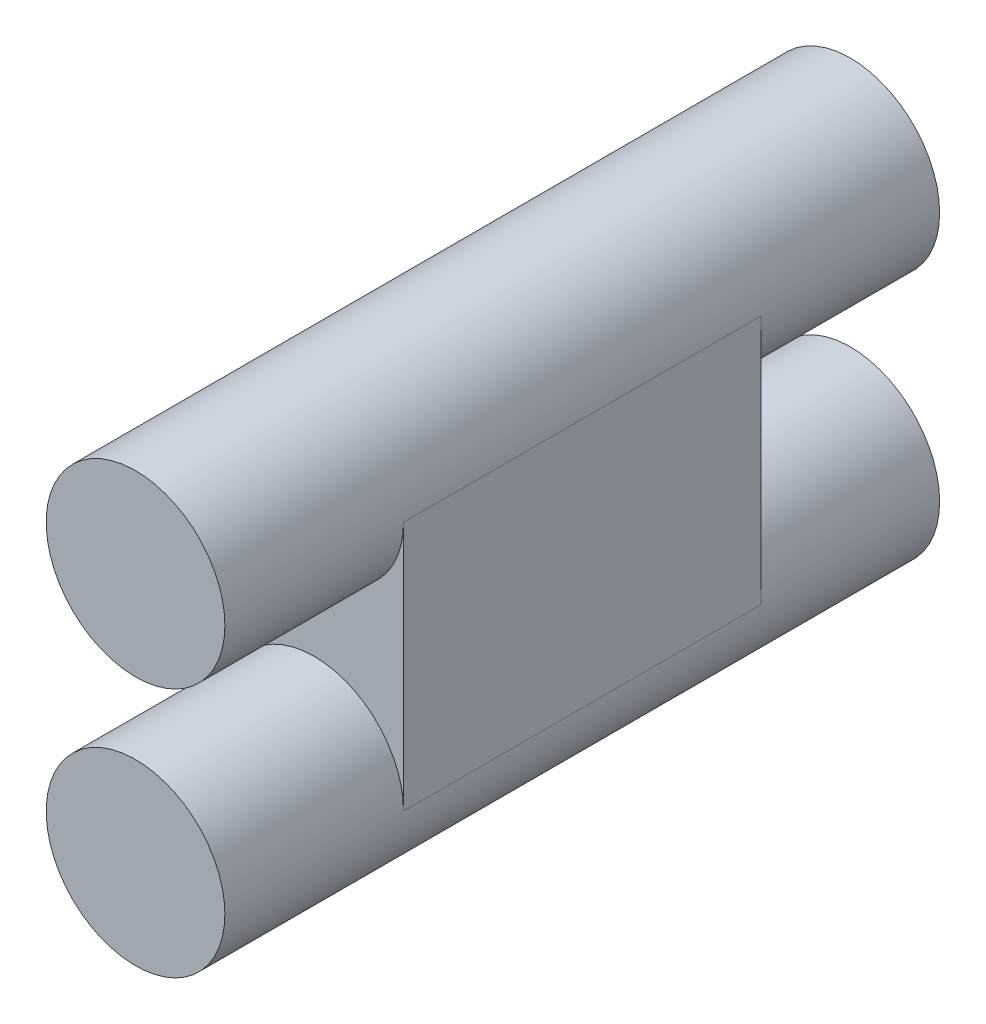
ISO-10303-21;
HEADER;
FILE_DESCRIPTION(('STEP AP214'),'2;1');
FILE_NAME('part.step','',(''),(''),'','','');
FILE_SCHEMA(('AUTOMOTIVE_DESIGN { 1 0 10303 214 1 1 1 1 }'));
ENDSEC;
DATA;
#1=APPLICATION_CONTEXT('core data for automotive mechanical design processes');
#2=APPLICATION_PROTOCOL_DEFINITION('international standard','automotive_design',2000,#1);
#3=PRODUCT_CONTEXT('',#1,'mechanical');
#4=PRODUCT('Part','Part','',(#3));
#5=PRODUCT_RELATED_PRODUCT_CATEGORY('part','',(#4));
#6=PRODUCT_DEFINITION_FORMATION('','',#4);
#7=PRODUCT_DEFINITION_CONTEXT('part definition',#1,'design');
#8=PRODUCT_DEFINITION('design','',#6,#7);
#9=PRODUCT_DEFINITION_SHAPE('','',#8);
#10=(LENGTH_UNIT() NAMED_UNIT(*) SI_UNIT(.MILLI.,.METRE.));
#11=(NAMED_UNIT(*) PLANE_ANGLE_UNIT() SI_UNIT($,.RADIAN.));
#12=(NAMED_UNIT(*) SI_UNIT($,.STERADIAN.) SOLID_ANGLE_UNIT());
#13=UNCERTAINTY_MEASURE_WITH_UNIT(LENGTH_MEASURE(1.E-05),#10,'distance_accuracy_value','');
#14=(GEOMETRIC_REPRESENTATION_CONTEXT(3) GLOBAL_UNCERTAINTY_ASSIGNED_CONTEXT((#13)) GLOBAL_UNIT_ASSIGNED_CONTEXT((#10,
#11,#12)) REPRESENTATION_CONTEXT('',''));
#15=CARTESIAN_POINT('',(0.,0.,0.));
#16=DIRECTION('',(0.,0.,1.));
#17=DIRECTION('',(1.,0.,0.));
#18=AXIS2_PLACEMENT_3D('',#15,#16,#17);
#19=CARTESIAN_POINT('',(0.,14.,10.));
#20=DIRECTION('',(0.,0.,-1.));
#21=DIRECTION('',(-1.,0.,0.));
#22=AXIS2_PLACEMENT_3D('',#19,#20,#21);
#23=PLANE('',#22);
#24=CARTESIAN_POINT('',(5.,0.,10.));
#25=DIRECTION('',(0.,0.,-1.));
#26=DIRECTION('',(-1.,0.,0.));
#27=AXIS2_PLACEMENT_3D('',#24,#25,#26);
#28=CIRCLE('',#27,5.);
#29=CARTESIAN_POINT('',(10.,0.,10.));
#30=VERTEX_POINT('',#29);
#31=CARTESIAN_POINT('',(0.,0.,10.));
#32=VERTEX_POINT('',#31);
#33=EDGE_CURVE('E100',#30,#32,#28,.F.);
#34=ORIENTED_EDGE('',*,*,#33,.F.);
#35=DIRECTION('',(0.,-1.,0.));
#36=VECTOR('',#35,1.);
#37=CARTESIAN_POINT('',(10.,14.,10.));
#38=LINE('',#37,#36);
#39=CARTESIAN_POINT('',(10.,14.,10.));
#40=VERTEX_POINT('',#39);
#41=EDGE_CURVE('E43',#40,#30,#38,.T.);
#42=ORIENTED_EDGE('',*,*,#41,.F.);
#43=CARTESIAN_POINT('',(5.,14.,10.));
#44=DIRECTION('',(0.,0.,-1.));
#45=DIRECTION('',(-1.,0.,0.));
#46=AXIS2_PLACEMENT_3D('',#43,#44,#45);
#47=CIRCLE('',#46,5.);
#48=CARTESIAN_POINT('',(0.,14.,10.));
#49=VERTEX_POINT('',#48);
#50=EDGE_CURVE('E53',#49,#40,#47,.F.);
#51=ORIENTED_EDGE('',*,*,#50,.F.);
#52=DIRECTION('',(0.,-1.,0.));
#53=VECTOR('',#52,1.);
#54=CARTESIAN_POINT('',(0.,14.,10.));
#55=LINE('',#54,#53);
#56=EDGE_CURVE('E11',#49,#32,#55,.T.);
#57=ORIENTED_EDGE('',*,*,#56,.T.);
#58=EDGE_LOOP('',(#34,#42,#51,#57));
#59=FACE_BOUND('',#58,.T.);
#60=ADVANCED_FACE('F35',(#59),#23,.F.);
#61=CARTESIAN_POINT('',(0.,14.,0.));
#62=DIRECTION('',(1.,0.,0.));
#63=DIRECTION('',(0.,0.,-1.));
#64=AXIS2_PLACEMENT_3D('',#61,#62,#63);
#65=PLANE('',#64);
#66=DIRECTION('',(0.,0.,1.));
#67=VECTOR('',#66,1.);
#68=CARTESIAN_POINT('',(0.,0.,0.));
#69=LINE('',#68,#67);
#70=CARTESIAN_POINT('',(0.,0.,-10.));
#71=VERTEX_POINT('',#70);
#72=EDGE_CURVE('E109',#71,#32,#69,.T.);
#73=ORIENTED_EDGE('',*,*,#72,.T.);
#74=ORIENTED_EDGE('',*,*,#56,.F.);
#75=DIRECTION('',(0.,0.,1.));
#76=VECTOR('',#75,1.);
#77=CARTESIAN_POINT('',(0.,14.,0.));
#78=LINE('',#77,#76);
#79=CARTESIAN_POINT('',(0.,14.,-10.));
#80=VERTEX_POINT('',#79);
#81=EDGE_CURVE('E83',#80,#49,#78,.T.);
#82=ORIENTED_EDGE('',*,*,#81,.F.);
#83=DIRECTION('',(0.,-1.,0.));
#84=VECTOR('',#83,1.);
#85=CARTESIAN_POINT('',(0.,14.,-10.));
#86=LINE('',#85,#84);
#87=EDGE_CURVE('E92',#80,#71,#86,.T.);
#88=ORIENTED_EDGE('',*,*,#87,.T.);
#89=EDGE_LOOP('',(#73,#74,#82,#88));
#90=FACE_BOUND('',#89,.T.);
#91=ADVANCED_FACE('F37',(#90),#65,.F.);
#92=CARTESIAN_POINT('',(10.,14.,0.));
#93=DIRECTION('',(-1.,0.,0.));
#94=DIRECTION('',(0.,0.,1.));
#95=AXIS2_PLACEMENT_3D('',#92,#93,#94);
#96=PLANE('',#95);
#97=DIRECTION('',(0.,0.,-1.));
#98=VECTOR('',#97,1.);
#99=CARTESIAN_POINT('',(10.,0.,0.));
#100=LINE('',#99,#98);
#101=CARTESIAN_POINT('',(10.,0.,-10.));
#102=VERTEX_POINT('',#101);
#103=EDGE_CURVE('E96',#30,#102,#100,.T.);
#104=ORIENTED_EDGE('',*,*,#103,.T.);
#105=DIRECTION('',(0.,-1.,0.));
#106=VECTOR('',#105,1.);
#107=CARTESIAN_POINT('',(10.,14.,-10.));
#108=LINE('',#107,#106);
#109=CARTESIAN_POINT('',(10.,14.,-10.));
#110=VERTEX_POINT('',#109);
#111=EDGE_CURVE('E89',#110,#102,#108,.T.);
#112=ORIENTED_EDGE('',*,*,#111,.F.);
#113=DIRECTION('',(0.,0.,-1.));
#114=VECTOR('',#113,1.);
#115=CARTESIAN_POINT('',(10.,14.,0.));
#116=LINE('',#115,#114);
#117=EDGE_CURVE('E74',#40,#110,#116,.T.);
#118=ORIENTED_EDGE('',*,*,#117,.F.);
#119=ORIENTED_EDGE('',*,*,#41,.T.);
#120=EDGE_LOOP('',(#104,#112,#118,#119));
#121=FACE_BOUND('',#120,.T.);
#122=ADVANCED_FACE('F95',(#121),#96,.F.);
#123=CARTESIAN_POINT('',(5.,14.,20.));
#124=DIRECTION('',(0.,0.,-1.));
#125=DIRECTION('',(-1.,0.,0.));
#126=AXIS2_PLACEMENT_3D('',#123,#124,#125);
#127=CYLINDRICAL_SURFACE('',#126,5.);
#128=ORIENTED_EDGE('',*,*,#117,.T.);
#129=CARTESIAN_POINT('',(5.,14.,-10.));
#130=DIRECTION('',(0.,0.,-1.));
#131=DIRECTION('',(-1.,0.,0.));
#132=AXIS2_PLACEMENT_3D('',#129,#130,#131);
#133=CIRCLE('',#132,5.);
#134=EDGE_CURVE('E79',#110,#80,#133,.T.);
#135=ORIENTED_EDGE('',*,*,#134,.T.);
#136=ORIENTED_EDGE('',*,*,#81,.T.);
#137=ORIENTED_EDGE('',*,*,#50,.T.);
#138=EDGE_LOOP('',(#128,#135,#136,#137));
#139=FACE_BOUND('',#138,.T.);
#140=CARTESIAN_POINT('',(5.,14.,20.));
#141=DIRECTION('',(0.,0.,1.));
#142=DIRECTION('',(1.,0.,0.));
#143=AXIS2_PLACEMENT_3D('',#140,#141,#142);
#144=CIRCLE('',#143,5.);
#145=CARTESIAN_POINT('',(10.,14.,20.));
#146=VERTEX_POINT('',#145);
#147=EDGE_CURVE('E105',#146,#146,#144,.T.);
#148=ORIENTED_EDGE('',*,*,#147,.F.);
#149=EDGE_LOOP('',(#148));
#150=FACE_BOUND('',#149,.T.);
#151=CARTESIAN_POINT('',(5.,14.,-20.));
#152=DIRECTION('',(0.,0.,1.));
#153=DIRECTION('',(1.,0.,0.));
#154=AXIS2_PLACEMENT_3D('',#151,#152,#153);
#155=CIRCLE('',#154,5.);
#156=CARTESIAN_POINT('',(10.,14.,-20.));
#157=VERTEX_POINT('',#156);
#158=EDGE_CURVE('E93',#157,#157,#155,.T.);
#159=ORIENTED_EDGE('',*,*,#158,.T.);
#160=EDGE_LOOP('',(#159));
#161=FACE_BOUND('',#160,.T.);
#162=ADVANCED_FACE('F76',(#139,#150,#161),#127,.T.);
#163=CARTESIAN_POINT('',(5.,14.,20.));
#164=DIRECTION('',(0.,0.,1.));
#165=DIRECTION('',(1.,0.,0.));
#166=AXIS2_PLACEMENT_3D('',#163,#164,#165);
#167=PLANE('',#166);
#168=ORIENTED_EDGE('',*,*,#147,.T.);
#169=EDGE_LOOP('',(#168));
#170=FACE_BOUND('',#169,.T.);
#171=ADVANCED_FACE('F144',(#170),#167,.T.);
#172=CARTESIAN_POINT('',(5.,0.,20.));
#173=DIRECTION('',(0.,0.,-1.));
#174=DIRECTION('',(-1.,0.,0.));
#175=AXIS2_PLACEMENT_3D('',#172,#173,#174);
#176=CYLINDRICAL_SURFACE('',#175,5.);
#177=CARTESIAN_POINT('',(5.,0.,20.));
#178=DIRECTION('',(0.,0.,1.));
#179=DIRECTION('',(1.,0.,0.));
#180=AXIS2_PLACEMENT_3D('',#177,#178,#179);
#181=CIRCLE('',#180,5.);
#182=CARTESIAN_POINT('',(10.,0.,20.));
#183=VERTEX_POINT('',#182);
#184=EDGE_CURVE('E97',#183,#183,#181,.T.);
#185=ORIENTED_EDGE('',*,*,#184,.F.);
#186=EDGE_LOOP('',(#185));
#187=FACE_BOUND('',#186,.T.);
#188=ORIENTED_EDGE('',*,*,#72,.F.);
#189=CARTESIAN_POINT('',(5.,0.,-10.));
#190=DIRECTION('',(0.,0.,-1.));
#191=DIRECTION('',(-1.,0.,0.));
#192=AXIS2_PLACEMENT_3D('',#189,#190,#191);
#193=CIRCLE('',#192,5.);
#194=EDGE_CURVE('E117',#71,#102,#193,.T.);
#195=ORIENTED_EDGE('',*,*,#194,.T.);
#196=ORIENTED_EDGE('',*,*,#103,.F.);
#197=ORIENTED_EDGE('',*,*,#33,.T.);
#198=EDGE_LOOP('',(#188,#195,#196,#197));
#199=FACE_BOUND('',#198,.T.);
#200=CARTESIAN_POINT('',(5.,0.,-20.));
#201=DIRECTION('',(0.,0.,1.));
#202=DIRECTION('',(1.,0.,0.));
#203=AXIS2_PLACEMENT_3D('',#200,#201,#202);
#204=CIRCLE('',#203,5.);
#205=CARTESIAN_POINT('',(10.,0.,-20.));
#206=VERTEX_POINT('',#205);
#207=EDGE_CURVE('E118',#206,#206,#204,.T.);
#208=ORIENTED_EDGE('',*,*,#207,.T.);
#209=EDGE_LOOP('',(#208));
#210=FACE_BOUND('',#209,.T.);
#211=ADVANCED_FACE('F115',(#187,#199,#210),#176,.T.);
#212=CARTESIAN_POINT('',(5.,0.,20.));
#213=DIRECTION('',(0.,0.,1.));
#214=DIRECTION('',(1.,0.,0.));
#215=AXIS2_PLACEMENT_3D('',#212,#213,#214);
#216=PLANE('',#215);
#217=ORIENTED_EDGE('',*,*,#184,.T.);
#218=EDGE_LOOP('',(#217));
#219=FACE_BOUND('',#218,.T.);
#220=ADVANCED_FACE('F150',(#219),#216,.T.);
#221=CARTESIAN_POINT('',(0.,14.,-10.));
#222=DIRECTION('',(0.,0.,-1.));
#223=DIRECTION('',(-1.,0.,0.));
#224=AXIS2_PLACEMENT_3D('',#221,#222,#223);
#225=PLANE('',#224);
#226=ORIENTED_EDGE('',*,*,#194,.F.);
#227=ORIENTED_EDGE('',*,*,#87,.F.);
#228=ORIENTED_EDGE('',*,*,#134,.F.);
#229=ORIENTED_EDGE('',*,*,#111,.T.);
#230=EDGE_LOOP('',(#226,#227,#228,#229));
#231=FACE_BOUND('',#230,.T.);
#232=ADVANCED_FACE('F88',(#231),#225,.T.);
#233=CARTESIAN_POINT('',(5.,14.,-20.));
#234=DIRECTION('',(0.,0.,-1.));
#235=DIRECTION('',(1.,0.,0.));
#236=AXIS2_PLACEMENT_3D('',#233,#234,#235);
#237=PLANE('',#236);
#238=ORIENTED_EDGE('',*,*,#158,.F.);
#239=EDGE_LOOP('',(#238));
#240=FACE_BOUND('',#239,.T.);
#241=ADVANCED_FACE('F128',(#240),#237,.T.);
#242=CARTESIAN_POINT('',(5.,0.,-20.));
#243=DIRECTION('',(0.,0.,-1.));
#244=DIRECTION('',(1.,0.,0.));
#245=AXIS2_PLACEMENT_3D('',#242,#243,#244);
#246=PLANE('',#245);
#247=ORIENTED_EDGE('',*,*,#207,.F.);
#248=EDGE_LOOP('',(#247));
#249=FACE_BOUND('',#248,.T.);
#250=ADVANCED_FACE('F126',(#249),#246,.T.);
#251=CLOSED_SHELL('',(#60,#91,#122,#162,#171,#211,#220,#232,#241,#250));
#252=MANIFOLD_SOLID_BREP('B2',#251);
#253=ADVANCED_BREP_SHAPE_REPRESENTATION('',(#18,#252),#14);
#254=SHAPE_DEFINITION_REPRESENTATION(#9,#253);
ENDSEC;
END-ISO-10303-21;
